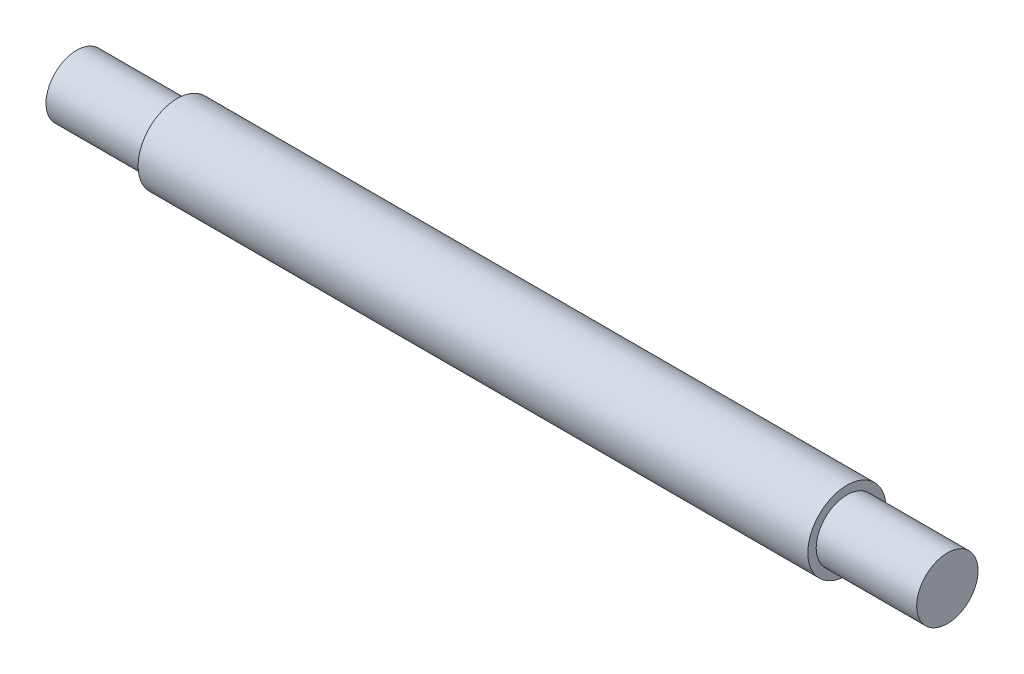
ISO-10303-21;
HEADER;
FILE_DESCRIPTION(('STEP AP214'),'2;1');
FILE_NAME('part.step','',(''),(''),'','','');
FILE_SCHEMA(('AUTOMOTIVE_DESIGN { 1 0 10303 214 1 1 1 1 }'));
ENDSEC;
DATA;
#1=APPLICATION_CONTEXT('core data for automotive mechanical design processes');
#2=APPLICATION_PROTOCOL_DEFINITION('international standard','automotive_design',2000,#1);
#3=PRODUCT_CONTEXT('',#1,'mechanical');
#4=PRODUCT('Part','Part','',(#3));
#5=PRODUCT_RELATED_PRODUCT_CATEGORY('part','',(#4));
#6=PRODUCT_DEFINITION_FORMATION('','',#4);
#7=PRODUCT_DEFINITION_CONTEXT('part definition',#1,'design');
#8=PRODUCT_DEFINITION('design','',#6,#7);
#9=PRODUCT_DEFINITION_SHAPE('','',#8);
#10=(LENGTH_UNIT() NAMED_UNIT(*) SI_UNIT(.MILLI.,.METRE.));
#11=(NAMED_UNIT(*) PLANE_ANGLE_UNIT() SI_UNIT($,.RADIAN.));
#12=(NAMED_UNIT(*) SI_UNIT($,.STERADIAN.) SOLID_ANGLE_UNIT());
#13=UNCERTAINTY_MEASURE_WITH_UNIT(LENGTH_MEASURE(1.E-05),#10,'distance_accuracy_value','');
#14=(GEOMETRIC_REPRESENTATION_CONTEXT(3) GLOBAL_UNCERTAINTY_ASSIGNED_CONTEXT((#13)) GLOBAL_UNIT_ASSIGNED_CONTEXT((#10,
#11,#12)) REPRESENTATION_CONTEXT('',''));
#15=CARTESIAN_POINT('',(0.,0.,0.));
#16=DIRECTION('',(0.,0.,1.));
#17=DIRECTION('',(1.,0.,0.));
#18=AXIS2_PLACEMENT_3D('',#15,#16,#17);
#19=CARTESIAN_POINT('',(0.,0.,-5.5));
#20=DIRECTION('',(1.,0.,0.));
#21=DIRECTION('',(0.,0.,-1.));
#22=AXIS2_PLACEMENT_3D('',#19,#20,#21);
#23=PLANE('',#22);
#24=CARTESIAN_POINT('',(0.,0.,0.));
#25=DIRECTION('',(-1.,0.,0.));
#26=DIRECTION('',(0.,0.,1.));
#27=AXIS2_PLACEMENT_3D('',#24,#25,#26);
#28=CIRCLE('',#27,5.5);
#29=CARTESIAN_POINT('',(0.,0.,5.5));
#30=VERTEX_POINT('',#29);
#31=EDGE_CURVE('E64',#30,#30,#28,.T.);
#32=ORIENTED_EDGE('',*,*,#31,.T.);
#33=EDGE_LOOP('',(#32));
#34=FACE_BOUND('',#33,.T.);
#35=ADVANCED_FACE('F37',(#34),#23,.F.);
#36=CARTESIAN_POINT('',(156.,0.,0.));
#37=DIRECTION('',(-1.,0.,0.));
#38=DIRECTION('',(0.,0.,1.));
#39=AXIS2_PLACEMENT_3D('',#36,#37,#38);
#40=PLANE('',#39);
#41=CARTESIAN_POINT('',(156.,0.,0.));
#42=DIRECTION('',(-1.,0.,0.));
#43=DIRECTION('',(0.,0.,1.));
#44=AXIS2_PLACEMENT_3D('',#41,#42,#43);
#45=CIRCLE('',#44,5.50000000000002);
#46=CARTESIAN_POINT('',(156.,0.,5.50000000000002));
#47=VERTEX_POINT('',#46);
#48=EDGE_CURVE('E10',#47,#47,#45,.T.);
#49=ORIENTED_EDGE('',*,*,#48,.F.);
#50=EDGE_LOOP('',(#49));
#51=FACE_BOUND('',#50,.T.);
#52=ADVANCED_FACE('F95',(#51),#40,.F.);
#53=CARTESIAN_POINT('',(0.,0.,0.));
#54=DIRECTION('',(-1.,0.,0.));
#55=DIRECTION('',(0.,0.,1.));
#56=AXIS2_PLACEMENT_3D('',#53,#54,#55);
#57=CYLINDRICAL_SURFACE('',#56,5.50000000000002);
#58=CARTESIAN_POINT('',(138.,0.,0.));
#59=DIRECTION('',(-1.,0.,0.));
#60=DIRECTION('',(0.,0.,1.));
#61=AXIS2_PLACEMENT_3D('',#58,#59,#60);
#62=CIRCLE('',#61,5.50000000000002);
#63=CARTESIAN_POINT('',(138.,0.,5.50000000000002));
#64=VERTEX_POINT('',#63);
#65=EDGE_CURVE('E44',#64,#64,#62,.T.);
#66=ORIENTED_EDGE('',*,*,#65,.F.);
#67=EDGE_LOOP('',(#66));
#68=FACE_BOUND('',#67,.T.);
#69=ORIENTED_EDGE('',*,*,#48,.T.);
#70=EDGE_LOOP('',(#69));
#71=FACE_BOUND('',#70,.T.);
#72=ADVANCED_FACE('F90',(#68,#71),#57,.T.);
#73=CARTESIAN_POINT('',(138.,0.,-5.50000000000002));
#74=DIRECTION('',(-1.,0.,0.));
#75=DIRECTION('',(0.,0.,1.));
#76=AXIS2_PLACEMENT_3D('',#73,#74,#75);
#77=PLANE('',#76);
#78=CARTESIAN_POINT('',(138.,0.,0.));
#79=DIRECTION('',(-1.,0.,0.));
#80=DIRECTION('',(0.,0.,1.));
#81=AXIS2_PLACEMENT_3D('',#78,#79,#80);
#82=CIRCLE('',#81,7.);
#83=CARTESIAN_POINT('',(138.,0.,7.));
#84=VERTEX_POINT('',#83);
#85=EDGE_CURVE('E49',#84,#84,#82,.T.);
#86=ORIENTED_EDGE('',*,*,#85,.F.);
#87=EDGE_LOOP('',(#86));
#88=FACE_BOUND('',#87,.T.);
#89=ORIENTED_EDGE('',*,*,#65,.T.);
#90=EDGE_LOOP('',(#89));
#91=FACE_BOUND('',#90,.T.);
#92=ADVANCED_FACE('F85',(#88,#91),#77,.F.);
#93=CARTESIAN_POINT('',(0.,0.,0.));
#94=DIRECTION('',(-1.,0.,0.));
#95=DIRECTION('',(0.,0.,1.));
#96=AXIS2_PLACEMENT_3D('',#93,#94,#95);
#97=CYLINDRICAL_SURFACE('',#96,6.99999999999999);
#98=CARTESIAN_POINT('',(18.,0.,0.));
#99=DIRECTION('',(-1.,0.,0.));
#100=DIRECTION('',(0.,0.,1.));
#101=AXIS2_PLACEMENT_3D('',#98,#99,#100);
#102=CIRCLE('',#101,6.99999999999999);
#103=CARTESIAN_POINT('',(18.,0.,6.99999999999999));
#104=VERTEX_POINT('',#103);
#105=EDGE_CURVE('E54',#104,#104,#102,.T.);
#106=ORIENTED_EDGE('',*,*,#105,.F.);
#107=EDGE_LOOP('',(#106));
#108=FACE_BOUND('',#107,.T.);
#109=ORIENTED_EDGE('',*,*,#85,.T.);
#110=EDGE_LOOP('',(#109));
#111=FACE_BOUND('',#110,.T.);
#112=ADVANCED_FACE('F79',(#108,#111),#97,.T.);
#113=CARTESIAN_POINT('',(18.,0.,-6.99999999999999));
#114=DIRECTION('',(1.,0.,0.));
#115=DIRECTION('',(0.,0.,-1.));
#116=AXIS2_PLACEMENT_3D('',#113,#114,#115);
#117=PLANE('',#116);
#118=CARTESIAN_POINT('',(18.,0.,0.));
#119=DIRECTION('',(-1.,0.,0.));
#120=DIRECTION('',(0.,0.,1.));
#121=AXIS2_PLACEMENT_3D('',#118,#119,#120);
#122=CIRCLE('',#121,5.5);
#123=CARTESIAN_POINT('',(18.,0.,5.5));
#124=VERTEX_POINT('',#123);
#125=EDGE_CURVE('E60',#124,#124,#122,.T.);
#126=ORIENTED_EDGE('',*,*,#125,.F.);
#127=EDGE_LOOP('',(#126));
#128=FACE_BOUND('',#127,.T.);
#129=ORIENTED_EDGE('',*,*,#105,.T.);
#130=EDGE_LOOP('',(#129));
#131=FACE_BOUND('',#130,.T.);
#132=ADVANCED_FACE('F73',(#128,#131),#117,.F.);
#133=CARTESIAN_POINT('',(0.,0.,0.));
#134=DIRECTION('',(-1.,0.,0.));
#135=DIRECTION('',(0.,0.,1.));
#136=AXIS2_PLACEMENT_3D('',#133,#134,#135);
#137=CYLINDRICAL_SURFACE('',#136,5.5);
#138=ORIENTED_EDGE('',*,*,#31,.F.);
#139=EDGE_LOOP('',(#138));
#140=FACE_BOUND('',#139,.T.);
#141=ORIENTED_EDGE('',*,*,#125,.T.);
#142=EDGE_LOOP('',(#141));
#143=FACE_BOUND('',#142,.T.);
#144=ADVANCED_FACE('F70',(#140,#143),#137,.T.);
#145=CLOSED_SHELL('',(#35,#52,#72,#92,#112,#132,#144));
#146=MANIFOLD_SOLID_BREP('B2',#145);
#147=ADVANCED_BREP_SHAPE_REPRESENTATION('',(#18,#146),#14);
#148=SHAPE_DEFINITION_REPRESENTATION(#9,#147);
ENDSEC;
END-ISO-10303-21;
